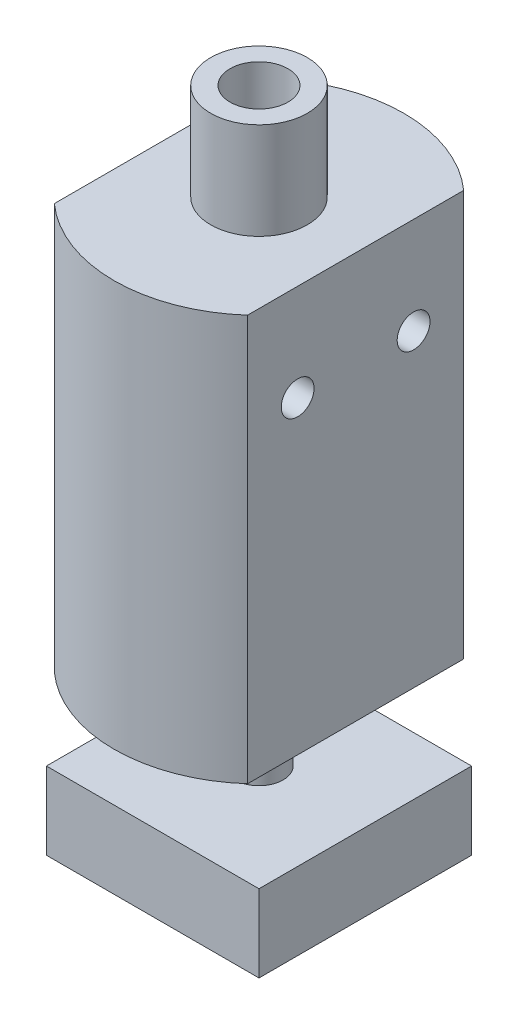
ISO-10303-21;
HEADER;
FILE_DESCRIPTION(('STEP AP214'),'2;1');
FILE_NAME('part.step','',(''),(''),'','','');
FILE_SCHEMA(('AUTOMOTIVE_DESIGN { 1 0 10303 214 1 1 1 1 }'));
ENDSEC;
DATA;
#1=APPLICATION_CONTEXT('core data for automotive mechanical design processes');
#2=APPLICATION_PROTOCOL_DEFINITION('international standard','automotive_design',2000,#1);
#3=PRODUCT_CONTEXT('',#1,'mechanical');
#4=PRODUCT('Part','Part','',(#3));
#5=PRODUCT_RELATED_PRODUCT_CATEGORY('part','',(#4));
#6=PRODUCT_DEFINITION_FORMATION('','',#4);
#7=PRODUCT_DEFINITION_CONTEXT('part definition',#1,'design');
#8=PRODUCT_DEFINITION('design','',#6,#7);
#9=PRODUCT_DEFINITION_SHAPE('','',#8);
#10=(LENGTH_UNIT() NAMED_UNIT(*) SI_UNIT(.MILLI.,.METRE.));
#11=(NAMED_UNIT(*) PLANE_ANGLE_UNIT() SI_UNIT($,.RADIAN.));
#12=(NAMED_UNIT(*) SI_UNIT($,.STERADIAN.) SOLID_ANGLE_UNIT());
#13=UNCERTAINTY_MEASURE_WITH_UNIT(LENGTH_MEASURE(1.E-05),#10,'distance_accuracy_value','');
#14=(GEOMETRIC_REPRESENTATION_CONTEXT(3) GLOBAL_UNCERTAINTY_ASSIGNED_CONTEXT((#13)) GLOBAL_UNIT_ASSIGNED_CONTEXT((#10,
#11,#12)) REPRESENTATION_CONTEXT('',''));
#15=CARTESIAN_POINT('',(0.,0.,0.));
#16=DIRECTION('',(0.,0.,1.));
#17=DIRECTION('',(1.,0.,0.));
#18=AXIS2_PLACEMENT_3D('',#15,#16,#17);
#19=CARTESIAN_POINT('',(2.5,0.,0.));
#20=DIRECTION('',(0.,-1.,0.));
#21=DIRECTION('',(0.,0.,-1.));
#22=AXIS2_PLACEMENT_3D('',#19,#20,#21);
#23=PLANE('',#22);
#24=DIRECTION('',(0.,0.,1.));
#25=VECTOR('',#24,1.);
#26=CARTESIAN_POINT('',(-10.,0.,0.));
#27=LINE('',#26,#25);
#28=CARTESIAN_POINT('',(-10.,0.,-11.1803398874989));
#29=VERTEX_POINT('',#28);
#30=CARTESIAN_POINT('',(-10.,0.,11.1803398874989));
#31=VERTEX_POINT('',#30);
#32=EDGE_CURVE('E208',#29,#31,#27,.T.);
#33=ORIENTED_EDGE('',*,*,#32,.F.);
#34=CARTESIAN_POINT('',(0.,0.,0.));
#35=DIRECTION('',(0.,-1.,0.));
#36=DIRECTION('',(0.,0.,-1.));
#37=AXIS2_PLACEMENT_3D('',#34,#35,#36);
#38=CIRCLE('',#37,15.);
#39=CARTESIAN_POINT('',(10.,0.,-11.180339887499));
#40=VERTEX_POINT('',#39);
#41=EDGE_CURVE('E226',#29,#40,#38,.T.);
#42=ORIENTED_EDGE('',*,*,#41,.T.);
#43=DIRECTION('',(0.,0.,1.));
#44=VECTOR('',#43,1.);
#45=CARTESIAN_POINT('',(10.,0.,0.));
#46=LINE('',#45,#44);
#47=CARTESIAN_POINT('',(10.,0.,11.180339887499));
#48=VERTEX_POINT('',#47);
#49=EDGE_CURVE('E202',#40,#48,#46,.T.);
#50=ORIENTED_EDGE('',*,*,#49,.T.);
#51=EDGE_CURVE('E229',#48,#31,#38,.T.);
#52=ORIENTED_EDGE('',*,*,#51,.T.);
#53=EDGE_LOOP('',(#33,#42,#50,#52));
#54=FACE_BOUND('',#53,.T.);
#55=CARTESIAN_POINT('',(0.,0.,0.));
#56=DIRECTION('',(0.,-1.,0.));
#57=DIRECTION('',(0.,0.,-1.));
#58=AXIS2_PLACEMENT_3D('',#55,#56,#57);
#59=CIRCLE('',#58,2.5);
#60=CARTESIAN_POINT('',(0.,0.,-2.5));
#61=VERTEX_POINT('',#60);
#62=EDGE_CURVE('E230',#61,#61,#59,.T.);
#63=ORIENTED_EDGE('',*,*,#62,.F.);
#64=EDGE_LOOP('',(#63));
#65=FACE_BOUND('',#64,.T.);
#66=ADVANCED_FACE('F84',(#54,#65),#23,.T.);
#67=CARTESIAN_POINT('',(0.,0.,0.));
#68=DIRECTION('',(0.,-1.,0.));
#69=DIRECTION('',(0.,0.,-1.));
#70=AXIS2_PLACEMENT_3D('',#67,#68,#69);
#71=CYLINDRICAL_SURFACE('',#70,15.);
#72=DIRECTION('',(0.,-1.,0.));
#73=VECTOR('',#72,1.);
#74=CARTESIAN_POINT('',(-10.,0.,11.1803398874989));
#75=LINE('',#74,#73);
#76=CARTESIAN_POINT('',(-10.,42.,11.1803398874989));
#77=VERTEX_POINT('',#76);
#78=EDGE_CURVE('E101',#31,#77,#75,.F.);
#79=ORIENTED_EDGE('',*,*,#78,.F.);
#80=ORIENTED_EDGE('',*,*,#51,.F.);
#81=DIRECTION('',(0.,-1.,0.));
#82=VECTOR('',#81,1.);
#83=CARTESIAN_POINT('',(10.,0.,11.180339887499));
#84=LINE('',#83,#82);
#85=CARTESIAN_POINT('',(10.,42.,11.180339887499));
#86=VERTEX_POINT('',#85);
#87=EDGE_CURVE('E199',#48,#86,#84,.F.);
#88=ORIENTED_EDGE('',*,*,#87,.T.);
#89=CARTESIAN_POINT('',(0.,42.,0.));
#90=DIRECTION('',(0.,-1.,0.));
#91=DIRECTION('',(0.,0.,-1.));
#92=AXIS2_PLACEMENT_3D('',#89,#90,#91);
#93=CIRCLE('',#92,15.);
#94=EDGE_CURVE('E225',#86,#77,#93,.T.);
#95=ORIENTED_EDGE('',*,*,#94,.T.);
#96=EDGE_LOOP('',(#79,#80,#88,#95));
#97=FACE_BOUND('',#96,.T.);
#98=ADVANCED_FACE('F257',(#97),#71,.T.);
#99=DIRECTION('',(0.,-1.,0.));
#100=VECTOR('',#99,1.);
#101=CARTESIAN_POINT('',(-10.,0.,-11.1803398874989));
#102=LINE('',#101,#100);
#103=CARTESIAN_POINT('',(-10.,42.,-11.1803398874989));
#104=VERTEX_POINT('',#103);
#105=EDGE_CURVE('E205',#104,#29,#102,.T.);
#106=ORIENTED_EDGE('',*,*,#105,.F.);
#107=CARTESIAN_POINT('',(10.,42.,-11.180339887499));
#108=VERTEX_POINT('',#107);
#109=EDGE_CURVE('E222',#104,#108,#93,.T.);
#110=ORIENTED_EDGE('',*,*,#109,.T.);
#111=DIRECTION('',(0.,-1.,0.));
#112=VECTOR('',#111,1.);
#113=CARTESIAN_POINT('',(10.,0.,-11.180339887499));
#114=LINE('',#113,#112);
#115=EDGE_CURVE('E109',#108,#40,#114,.T.);
#116=ORIENTED_EDGE('',*,*,#115,.T.);
#117=ORIENTED_EDGE('',*,*,#41,.F.);
#118=EDGE_LOOP('',(#106,#110,#116,#117));
#119=FACE_BOUND('',#118,.T.);
#120=ADVANCED_FACE('F263',(#119),#71,.T.);
#121=CARTESIAN_POINT('',(15.,42.,0.));
#122=DIRECTION('',(0.,1.,0.));
#123=DIRECTION('',(0.,0.,1.));
#124=AXIS2_PLACEMENT_3D('',#121,#122,#123);
#125=PLANE('',#124);
#126=DIRECTION('',(0.,0.,-1.));
#127=VECTOR('',#126,1.);
#128=CARTESIAN_POINT('',(-10.,42.,0.));
#129=LINE('',#128,#127);
#130=EDGE_CURVE('E241',#77,#104,#129,.T.);
#131=ORIENTED_EDGE('',*,*,#130,.F.);
#132=ORIENTED_EDGE('',*,*,#94,.F.);
#133=DIRECTION('',(0.,0.,-1.));
#134=VECTOR('',#133,1.);
#135=CARTESIAN_POINT('',(10.,42.,0.));
#136=LINE('',#135,#134);
#137=EDGE_CURVE('E239',#86,#108,#136,.T.);
#138=ORIENTED_EDGE('',*,*,#137,.T.);
#139=ORIENTED_EDGE('',*,*,#109,.F.);
#140=EDGE_LOOP('',(#131,#132,#138,#139));
#141=FACE_BOUND('',#140,.T.);
#142=CARTESIAN_POINT('',(0.,42.,0.));
#143=DIRECTION('',(0.,-1.,0.));
#144=DIRECTION('',(0.,0.,-1.));
#145=AXIS2_PLACEMENT_3D('',#142,#143,#144);
#146=CIRCLE('',#145,5.);
#147=CARTESIAN_POINT('',(0.,42.,-5.));
#148=VERTEX_POINT('',#147);
#149=EDGE_CURVE('E219',#148,#148,#146,.T.);
#150=ORIENTED_EDGE('',*,*,#149,.T.);
#151=EDGE_LOOP('',(#150));
#152=FACE_BOUND('',#151,.T.);
#153=ADVANCED_FACE('F251',(#141,#152),#125,.T.);
#154=CARTESIAN_POINT('',(0.,0.,0.));
#155=DIRECTION('',(0.,-1.,0.));
#156=DIRECTION('',(0.,0.,-1.));
#157=AXIS2_PLACEMENT_3D('',#154,#155,#156);
#158=CYLINDRICAL_SURFACE('',#157,2.5);
#159=CARTESIAN_POINT('',(0.,-9.,0.));
#160=DIRECTION('',(0.,1.,0.));
#161=DIRECTION('',(0.,0.,1.));
#162=AXIS2_PLACEMENT_3D('',#159,#160,#161);
#163=CIRCLE('',#162,2.5);
#164=CARTESIAN_POINT('',(0.,-9.,2.5));
#165=VERTEX_POINT('',#164);
#166=EDGE_CURVE('E93',#165,#165,#163,.F.);
#167=ORIENTED_EDGE('',*,*,#166,.F.);
#168=EDGE_LOOP('',(#167));
#169=FACE_BOUND('',#168,.T.);
#170=ORIENTED_EDGE('',*,*,#62,.T.);
#171=EDGE_LOOP('',(#170));
#172=FACE_BOUND('',#171,.T.);
#173=ADVANCED_FACE('F247',(#169,#172),#158,.T.);
#174=CARTESIAN_POINT('',(0.,0.,0.));
#175=DIRECTION('',(0.,-1.,0.));
#176=DIRECTION('',(0.,0.,-1.));
#177=AXIS2_PLACEMENT_3D('',#174,#175,#176);
#178=CYLINDRICAL_SURFACE('',#177,5.);
#179=CARTESIAN_POINT('',(0.,52.,0.));
#180=DIRECTION('',(0.,-1.,0.));
#181=DIRECTION('',(0.,0.,-1.));
#182=AXIS2_PLACEMENT_3D('',#179,#180,#181);
#183=CIRCLE('',#182,5.);
#184=CARTESIAN_POINT('',(0.,52.,-5.));
#185=VERTEX_POINT('',#184);
#186=EDGE_CURVE('E216',#185,#185,#183,.T.);
#187=ORIENTED_EDGE('',*,*,#186,.T.);
#188=EDGE_LOOP('',(#187));
#189=FACE_BOUND('',#188,.T.);
#190=ORIENTED_EDGE('',*,*,#149,.F.);
#191=EDGE_LOOP('',(#190));
#192=FACE_BOUND('',#191,.T.);
#193=ADVANCED_FACE('F250',(#189,#192),#178,.T.);
#194=CARTESIAN_POINT('',(5.,52.,0.));
#195=DIRECTION('',(0.,1.,0.));
#196=DIRECTION('',(0.,0.,1.));
#197=AXIS2_PLACEMENT_3D('',#194,#195,#196);
#198=PLANE('',#197);
#199=CARTESIAN_POINT('',(0.,52.,0.));
#200=DIRECTION('',(0.,-1.,0.));
#201=DIRECTION('',(0.,0.,-1.));
#202=AXIS2_PLACEMENT_3D('',#199,#200,#201);
#203=CIRCLE('',#202,3.);
#204=CARTESIAN_POINT('',(0.,52.,-3.));
#205=VERTEX_POINT('',#204);
#206=EDGE_CURVE('E213',#205,#205,#203,.T.);
#207=ORIENTED_EDGE('',*,*,#206,.T.);
#208=EDGE_LOOP('',(#207));
#209=FACE_BOUND('',#208,.T.);
#210=ORIENTED_EDGE('',*,*,#186,.F.);
#211=EDGE_LOOP('',(#210));
#212=FACE_BOUND('',#211,.T.);
#213=ADVANCED_FACE('F322',(#209,#212),#198,.T.);
#214=CARTESIAN_POINT('',(0.,0.,0.));
#215=DIRECTION('',(0.,-1.,0.));
#216=DIRECTION('',(0.,0.,-1.));
#217=AXIS2_PLACEMENT_3D('',#214,#215,#216);
#218=CYLINDRICAL_SURFACE('',#217,3.);
#219=CARTESIAN_POINT('',(0.,42.,0.));
#220=DIRECTION('',(0.,-1.,0.));
#221=DIRECTION('',(0.,0.,-1.));
#222=AXIS2_PLACEMENT_3D('',#219,#220,#221);
#223=CIRCLE('',#222,3.);
#224=CARTESIAN_POINT('',(0.,42.,-3.));
#225=VERTEX_POINT('',#224);
#226=EDGE_CURVE('E210',#225,#225,#223,.T.);
#227=ORIENTED_EDGE('',*,*,#226,.T.);
#228=EDGE_LOOP('',(#227));
#229=FACE_BOUND('',#228,.T.);
#230=ORIENTED_EDGE('',*,*,#206,.F.);
#231=EDGE_LOOP('',(#230));
#232=FACE_BOUND('',#231,.T.);
#233=ADVANCED_FACE('F318',(#229,#232),#218,.F.);
#234=CARTESIAN_POINT('',(3.,42.,0.));
#235=DIRECTION('',(0.,1.,0.));
#236=DIRECTION('',(0.,0.,1.));
#237=AXIS2_PLACEMENT_3D('',#234,#235,#236);
#238=PLANE('',#237);
#239=ORIENTED_EDGE('',*,*,#226,.F.);
#240=EDGE_LOOP('',(#239));
#241=FACE_BOUND('',#240,.T.);
#242=ADVANCED_FACE('F311',(#241),#238,.T.);
#243=CARTESIAN_POINT('',(10.,-23.,-15.));
#244=DIRECTION('',(1.,0.,0.));
#245=DIRECTION('',(0.,0.,-1.));
#246=AXIS2_PLACEMENT_3D('',#243,#244,#245);
#247=PLANE('',#246);
#248=CARTESIAN_POINT('',(10.,32.,-6.));
#249=DIRECTION('',(1.,0.,0.));
#250=DIRECTION('',(0.,0.,1.));
#251=AXIS2_PLACEMENT_3D('',#248,#249,#250);
#252=CIRCLE('',#251,1.7);
#253=CARTESIAN_POINT('',(10.,32.,-4.3));
#254=VERTEX_POINT('',#253);
#255=EDGE_CURVE('E467',#254,#254,#252,.T.);
#256=ORIENTED_EDGE('',*,*,#255,.F.);
#257=EDGE_LOOP('',(#256));
#258=FACE_BOUND('',#257,.T.);
#259=CARTESIAN_POINT('',(10.,32.,6.));
#260=DIRECTION('',(1.,0.,0.));
#261=DIRECTION('',(0.,0.,-1.));
#262=AXIS2_PLACEMENT_3D('',#259,#260,#261);
#263=CIRCLE('',#262,1.7);
#264=CARTESIAN_POINT('',(10.,32.,4.3));
#265=VERTEX_POINT('',#264);
#266=EDGE_CURVE('E179',#265,#265,#263,.T.);
#267=ORIENTED_EDGE('',*,*,#266,.F.);
#268=EDGE_LOOP('',(#267));
#269=FACE_BOUND('',#268,.T.);
#270=ORIENTED_EDGE('',*,*,#115,.F.);
#271=ORIENTED_EDGE('',*,*,#137,.F.);
#272=ORIENTED_EDGE('',*,*,#87,.F.);
#273=ORIENTED_EDGE('',*,*,#49,.F.);
#274=EDGE_LOOP('',(#270,#271,#272,#273));
#275=FACE_BOUND('',#274,.T.);
#276=ADVANCED_FACE('F308',(#258,#269,#275),#247,.T.);
#277=CARTESIAN_POINT('',(-10.,-23.,-15.));
#278=DIRECTION('',(1.,0.,0.));
#279=DIRECTION('',(0.,0.,-1.));
#280=AXIS2_PLACEMENT_3D('',#277,#278,#279);
#281=PLANE('',#280);
#282=CARTESIAN_POINT('',(-10.,32.,-6.));
#283=DIRECTION('',(1.,0.,0.));
#284=DIRECTION('',(0.,0.,-1.));
#285=AXIS2_PLACEMENT_3D('',#282,#283,#284);
#286=CIRCLE('',#285,1.7);
#287=CARTESIAN_POINT('',(-10.,32.,-7.7));
#288=VERTEX_POINT('',#287);
#289=EDGE_CURVE('E88',#288,#288,#286,.T.);
#290=ORIENTED_EDGE('',*,*,#289,.T.);
#291=EDGE_LOOP('',(#290));
#292=FACE_BOUND('',#291,.T.);
#293=CARTESIAN_POINT('',(-10.,32.,6.));
#294=DIRECTION('',(1.,0.,0.));
#295=DIRECTION('',(0.,0.,-1.));
#296=AXIS2_PLACEMENT_3D('',#293,#294,#295);
#297=CIRCLE('',#296,1.7);
#298=CARTESIAN_POINT('',(-10.,32.,4.3));
#299=VERTEX_POINT('',#298);
#300=EDGE_CURVE('E176',#299,#299,#297,.T.);
#301=ORIENTED_EDGE('',*,*,#300,.T.);
#302=EDGE_LOOP('',(#301));
#303=FACE_BOUND('',#302,.T.);
#304=ORIENTED_EDGE('',*,*,#32,.T.);
#305=ORIENTED_EDGE('',*,*,#78,.T.);
#306=ORIENTED_EDGE('',*,*,#130,.T.);
#307=ORIENTED_EDGE('',*,*,#105,.T.);
#308=EDGE_LOOP('',(#304,#305,#306,#307));
#309=FACE_BOUND('',#308,.T.);
#310=ADVANCED_FACE('F307',(#292,#303,#309),#281,.F.);
#311=CARTESIAN_POINT('',(11.,-17.,-11.));
#312=DIRECTION('',(1.,0.,0.));
#313=DIRECTION('',(0.,0.,-1.));
#314=AXIS2_PLACEMENT_3D('',#311,#312,#313);
#315=PLANE('',#314);
#316=DIRECTION('',(0.,0.,1.));
#317=VECTOR('',#316,1.);
#318=CARTESIAN_POINT('',(11.,-9.,-11.));
#319=LINE('',#318,#317);
#320=CARTESIAN_POINT('',(11.,-9.,-11.));
#321=VERTEX_POINT('',#320);
#322=CARTESIAN_POINT('',(11.,-9.,11.));
#323=VERTEX_POINT('',#322);
#324=EDGE_CURVE('E151',#321,#323,#319,.T.);
#325=ORIENTED_EDGE('',*,*,#324,.T.);
#326=DIRECTION('',(0.,1.,0.));
#327=VECTOR('',#326,1.);
#328=CARTESIAN_POINT('',(11.,-17.,11.));
#329=LINE('',#328,#327);
#330=CARTESIAN_POINT('',(11.,-17.,11.));
#331=VERTEX_POINT('',#330);
#332=EDGE_CURVE('E155',#331,#323,#329,.T.);
#333=ORIENTED_EDGE('',*,*,#332,.F.);
#334=DIRECTION('',(0.,0.,1.));
#335=VECTOR('',#334,1.);
#336=CARTESIAN_POINT('',(11.,-17.,-11.));
#337=LINE('',#336,#335);
#338=CARTESIAN_POINT('',(11.,-17.,-11.));
#339=VERTEX_POINT('',#338);
#340=EDGE_CURVE('E193',#339,#331,#337,.T.);
#341=ORIENTED_EDGE('',*,*,#340,.F.);
#342=DIRECTION('',(0.,1.,0.));
#343=VECTOR('',#342,1.);
#344=CARTESIAN_POINT('',(11.,-17.,-11.));
#345=LINE('',#344,#343);
#346=EDGE_CURVE('E157',#339,#321,#345,.T.);
#347=ORIENTED_EDGE('',*,*,#346,.T.);
#348=EDGE_LOOP('',(#325,#333,#341,#347));
#349=FACE_BOUND('',#348,.T.);
#350=ADVANCED_FACE('F153',(#349),#315,.T.);
#351=CARTESIAN_POINT('',(-11.,-17.,-11.));
#352=DIRECTION('',(0.,-1.,0.));
#353=DIRECTION('',(0.,0.,-1.));
#354=AXIS2_PLACEMENT_3D('',#351,#352,#353);
#355=PLANE('',#354);
#356=CARTESIAN_POINT('',(0.,-17.,0.));
#357=DIRECTION('',(0.,-1.,0.));
#358=DIRECTION('',(0.,0.,-1.));
#359=AXIS2_PLACEMENT_3D('',#356,#357,#358);
#360=CIRCLE('',#359,2.5);
#361=CARTESIAN_POINT('',(0.,-17.,-2.5));
#362=VERTEX_POINT('',#361);
#363=EDGE_CURVE('E13',#362,#362,#360,.F.);
#364=ORIENTED_EDGE('',*,*,#363,.T.);
#365=EDGE_LOOP('',(#364));
#366=FACE_BOUND('',#365,.T.);
#367=ORIENTED_EDGE('',*,*,#340,.T.);
#368=DIRECTION('',(1.,0.,0.));
#369=VECTOR('',#368,1.);
#370=CARTESIAN_POINT('',(-11.,-17.,11.));
#371=LINE('',#370,#369);
#372=CARTESIAN_POINT('',(-11.,-17.,11.));
#373=VERTEX_POINT('',#372);
#374=EDGE_CURVE('E175',#373,#331,#371,.T.);
#375=ORIENTED_EDGE('',*,*,#374,.F.);
#376=DIRECTION('',(0.,0.,1.));
#377=VECTOR('',#376,1.);
#378=CARTESIAN_POINT('',(-11.,-17.,-11.));
#379=LINE('',#378,#377);
#380=CARTESIAN_POINT('',(-11.,-17.,-11.));
#381=VERTEX_POINT('',#380);
#382=EDGE_CURVE('E195',#381,#373,#379,.T.);
#383=ORIENTED_EDGE('',*,*,#382,.F.);
#384=DIRECTION('',(1.,0.,0.));
#385=VECTOR('',#384,1.);
#386=CARTESIAN_POINT('',(-11.,-17.,-11.));
#387=LINE('',#386,#385);
#388=EDGE_CURVE('E162',#381,#339,#387,.T.);
#389=ORIENTED_EDGE('',*,*,#388,.T.);
#390=EDGE_LOOP('',(#367,#375,#383,#389));
#391=FACE_BOUND('',#390,.T.);
#392=ADVANCED_FACE('F295',(#366,#391),#355,.T.);
#393=CARTESIAN_POINT('',(-11.,-17.,-11.));
#394=DIRECTION('',(-1.,0.,0.));
#395=DIRECTION('',(0.,0.,1.));
#396=AXIS2_PLACEMENT_3D('',#393,#394,#395);
#397=PLANE('',#396);
#398=ORIENTED_EDGE('',*,*,#382,.T.);
#399=DIRECTION('',(0.,-1.,0.));
#400=VECTOR('',#399,1.);
#401=CARTESIAN_POINT('',(-11.,-17.,11.));
#402=LINE('',#401,#400);
#403=CARTESIAN_POINT('',(-11.,-9.,11.));
#404=VERTEX_POINT('',#403);
#405=EDGE_CURVE('E170',#404,#373,#402,.T.);
#406=ORIENTED_EDGE('',*,*,#405,.F.);
#407=DIRECTION('',(0.,0.,1.));
#408=VECTOR('',#407,1.);
#409=CARTESIAN_POINT('',(-11.,-9.,-11.));
#410=LINE('',#409,#408);
#411=CARTESIAN_POINT('',(-11.,-9.,-11.));
#412=VERTEX_POINT('',#411);
#413=EDGE_CURVE('E161',#412,#404,#410,.T.);
#414=ORIENTED_EDGE('',*,*,#413,.F.);
#415=DIRECTION('',(0.,-1.,0.));
#416=VECTOR('',#415,1.);
#417=CARTESIAN_POINT('',(-11.,-17.,-11.));
#418=LINE('',#417,#416);
#419=EDGE_CURVE('E188',#412,#381,#418,.T.);
#420=ORIENTED_EDGE('',*,*,#419,.T.);
#421=EDGE_LOOP('',(#398,#406,#414,#420));
#422=FACE_BOUND('',#421,.T.);
#423=ADVANCED_FACE('F298',(#422),#397,.T.);
#424=CARTESIAN_POINT('',(-11.,-9.,-11.));
#425=DIRECTION('',(0.,1.,0.));
#426=DIRECTION('',(0.,0.,1.));
#427=AXIS2_PLACEMENT_3D('',#424,#425,#426);
#428=PLANE('',#427);
#429=ORIENTED_EDGE('',*,*,#166,.T.);
#430=EDGE_LOOP('',(#429));
#431=FACE_BOUND('',#430,.T.);
#432=ORIENTED_EDGE('',*,*,#413,.T.);
#433=DIRECTION('',(-1.,0.,0.));
#434=VECTOR('',#433,1.);
#435=CARTESIAN_POINT('',(-11.,-9.,11.));
#436=LINE('',#435,#434);
#437=EDGE_CURVE('E165',#323,#404,#436,.T.);
#438=ORIENTED_EDGE('',*,*,#437,.F.);
#439=ORIENTED_EDGE('',*,*,#324,.F.);
#440=DIRECTION('',(-1.,0.,0.));
#441=VECTOR('',#440,1.);
#442=CARTESIAN_POINT('',(-11.,-9.,-11.));
#443=LINE('',#442,#441);
#444=EDGE_CURVE('E186',#321,#412,#443,.T.);
#445=ORIENTED_EDGE('',*,*,#444,.T.);
#446=EDGE_LOOP('',(#432,#438,#439,#445));
#447=FACE_BOUND('',#446,.T.);
#448=ADVANCED_FACE('F166',(#431,#447),#428,.T.);
#449=CARTESIAN_POINT('',(0.,0.,-11.));
#450=DIRECTION('',(0.,0.,-1.));
#451=DIRECTION('',(-1.,0.,0.));
#452=AXIS2_PLACEMENT_3D('',#449,#450,#451);
#453=PLANE('',#452);
#454=ORIENTED_EDGE('',*,*,#346,.F.);
#455=ORIENTED_EDGE('',*,*,#388,.F.);
#456=ORIENTED_EDGE('',*,*,#419,.F.);
#457=ORIENTED_EDGE('',*,*,#444,.F.);
#458=EDGE_LOOP('',(#454,#455,#456,#457));
#459=FACE_BOUND('',#458,.T.);
#460=ADVANCED_FACE('F285',(#459),#453,.T.);
#461=CARTESIAN_POINT('',(0.,0.,11.));
#462=DIRECTION('',(0.,0.,-1.));
#463=DIRECTION('',(-1.,0.,0.));
#464=AXIS2_PLACEMENT_3D('',#461,#462,#463);
#465=PLANE('',#464);
#466=ORIENTED_EDGE('',*,*,#332,.T.);
#467=ORIENTED_EDGE('',*,*,#437,.T.);
#468=ORIENTED_EDGE('',*,*,#405,.T.);
#469=ORIENTED_EDGE('',*,*,#374,.T.);
#470=EDGE_LOOP('',(#466,#467,#468,#469));
#471=FACE_BOUND('',#470,.T.);
#472=ADVANCED_FACE('F173',(#471),#465,.F.);
#473=CARTESIAN_POINT('',(0.2,-23.,0.));
#474=DIRECTION('',(0.,-1.,0.));
#475=DIRECTION('',(0.,0.,-1.));
#476=AXIS2_PLACEMENT_3D('',#473,#474,#475);
#477=PLANE('',#476);
#478=CARTESIAN_POINT('',(0.,-23.,0.));
#479=DIRECTION('',(0.,-1.,0.));
#480=DIRECTION('',(0.,0.,-1.));
#481=AXIS2_PLACEMENT_3D('',#478,#479,#480);
#482=CIRCLE('',#481,0.2);
#483=CARTESIAN_POINT('',(0.,-23.,0.200000000000001));
#484=VERTEX_POINT('',#483);
#485=EDGE_CURVE('E236',#484,#484,#482,.T.);
#486=ORIENTED_EDGE('',*,*,#485,.T.);
#487=EDGE_LOOP('',(#486));
#488=FACE_BOUND('',#487,.T.);
#489=ADVANCED_FACE('F86',(#488),#477,.T.);
#490=CARTESIAN_POINT('',(0.,-23.,0.));
#491=DIRECTION('',(0.,1.,0.));
#492=DIRECTION('',(0.,0.,1.));
#493=AXIS2_PLACEMENT_3D('',#490,#491,#492);
#494=CONICAL_SURFACE('',#493,0.2,0.523598775598303);
#495=CARTESIAN_POINT('',(0.,-19.0162831425916,0.));
#496=DIRECTION('',(0.,-1.,0.));
#497=DIRECTION('',(0.,0.,-1.));
#498=AXIS2_PLACEMENT_3D('',#495,#496,#497);
#499=CIRCLE('',#498,2.5);
#500=CARTESIAN_POINT('',(0.,-19.0162831425916,2.5));
#501=VERTEX_POINT('',#500);
#502=EDGE_CURVE('E233',#501,#501,#499,.T.);
#503=CARTESIAN_POINT('',(0.,-19.0162831425916,2.5));
#504=CARTESIAN_POINT('',(0.,-19.0577801931896,2.47604166666667));
#505=CARTESIAN_POINT('',(0.,-19.0992772437876,2.45208333333334));
#506=CARTESIAN_POINT('',(0.,-19.1822713449836,2.40416666666667));
#507=CARTESIAN_POINT('',(0.,-19.2237683955816,2.38020833333334));
#508=CARTESIAN_POINT('',(0.,-19.3067624967776,2.33229166666667));
#509=CARTESIAN_POINT('',(0.,-19.3482595473757,2.30833333333334));
#510=CARTESIAN_POINT('',(0.,-19.4312536485717,2.26041666666667));
#511=CARTESIAN_POINT('',(0.,-19.4727506991697,2.23645833333334));
#512=CARTESIAN_POINT('',(0.,-19.5557448003657,2.18854166666667));
#513=CARTESIAN_POINT('',(0.,-19.5972418509637,2.16458333333334));
#514=CARTESIAN_POINT('',(0.,-19.6802359521597,2.11666666666667));
#515=CARTESIAN_POINT('',(0.,-19.7217330027577,2.09270833333334));
#516=CARTESIAN_POINT('',(0.,-19.8047271039537,2.04479166666667));
#517=CARTESIAN_POINT('',(0.,-19.8462241545517,2.02083333333334));
#518=CARTESIAN_POINT('',(0.,-19.9292182557477,1.97291666666667));
#519=CARTESIAN_POINT('',(0.,-19.9707153063457,1.94895833333334));
#520=CARTESIAN_POINT('',(0.,-20.0537094075417,1.90104166666667));
#521=CARTESIAN_POINT('',(0.,-20.0952064581397,1.87708333333334));
#522=CARTESIAN_POINT('',(0.,-20.1782005593357,1.82916666666667));
#523=CARTESIAN_POINT('',(0.,-20.2196976099337,1.80520833333334));
#524=CARTESIAN_POINT('',(0.,-20.3026917111297,1.75729166666667));
#525=CARTESIAN_POINT('',(0.,-20.3441887617277,1.73333333333334));
#526=CARTESIAN_POINT('',(0.,-20.4271828629238,1.68541666666667));
#527=CARTESIAN_POINT('',(0.,-20.4686799135218,1.66145833333334));
#528=CARTESIAN_POINT('',(0.,-20.5516740147178,1.61354166666667));
#529=CARTESIAN_POINT('',(0.,-20.5931710653158,1.58958333333334));
#530=CARTESIAN_POINT('',(0.,-20.6761651665118,1.54166666666667));
#531=CARTESIAN_POINT('',(0.,-20.7176622171098,1.51770833333334));
#532=CARTESIAN_POINT('',(0.,-20.8006563183058,1.46979166666667));
#533=CARTESIAN_POINT('',(0.,-20.8421533689038,1.44583333333334));
#534=CARTESIAN_POINT('',(0.,-20.9251474700998,1.39791666666667));
#535=CARTESIAN_POINT('',(0.,-20.9666445206978,1.37395833333334));
#536=CARTESIAN_POINT('',(0.,-21.0496386218938,1.32604166666667));
#537=CARTESIAN_POINT('',(0.,-21.0911356724918,1.30208333333334));
#538=CARTESIAN_POINT('',(0.,-21.1741297736878,1.25416666666667));
#539=CARTESIAN_POINT('',(0.,-21.2156268242858,1.23020833333334));
#540=CARTESIAN_POINT('',(0.,-21.2986209254818,1.18229166666667));
#541=CARTESIAN_POINT('',(0.,-21.3401179760798,1.15833333333334));
#542=CARTESIAN_POINT('',(0.,-21.4231120772758,1.11041666666667));
#543=CARTESIAN_POINT('',(0.,-21.4646091278739,1.08645833333334));
#544=CARTESIAN_POINT('',(0.,-21.5476032290699,1.03854166666667));
#545=CARTESIAN_POINT('',(0.,-21.5891002796679,1.01458333333334));
#546=CARTESIAN_POINT('',(0.,-21.6720943808639,0.966666666666668));
#547=CARTESIAN_POINT('',(0.,-21.7135914314619,0.942708333333335));
#548=CARTESIAN_POINT('',(0.,-21.7965855326579,0.894791666666668));
#549=CARTESIAN_POINT('',(0.,-21.8380825832559,0.870833333333335));
#550=CARTESIAN_POINT('',(0.,-21.9210766844519,0.822916666666668));
#551=CARTESIAN_POINT('',(0.,-21.9625737350499,0.798958333333335));
#552=CARTESIAN_POINT('',(0.,-22.0455678362459,0.751041666666668));
#553=CARTESIAN_POINT('',(0.,-22.0870648868439,0.727083333333335));
#554=CARTESIAN_POINT('',(0.,-22.1700589880399,0.679166666666668));
#555=CARTESIAN_POINT('',(0.,-22.2115560386379,0.655208333333335));
#556=CARTESIAN_POINT('',(0.,-22.2945501398339,0.607291666666668));
#557=CARTESIAN_POINT('',(0.,-22.3360471904319,0.583333333333335));
#558=CARTESIAN_POINT('',(0.,-22.4190412916279,0.535416666666668));
#559=CARTESIAN_POINT('',(0.,-22.4605383422259,0.511458333333335));
#560=CARTESIAN_POINT('',(0.,-22.543532443422,0.463541666666668));
#561=CARTESIAN_POINT('',(0.,-22.58502949402,0.439583333333335));
#562=CARTESIAN_POINT('',(0.,-22.668023595216,0.391666666666668));
#563=CARTESIAN_POINT('',(0.,-22.709520645814,0.367708333333334));
#564=CARTESIAN_POINT('',(0.,-22.79251474701,0.319791666666668));
#565=CARTESIAN_POINT('',(0.,-22.834011797608,0.295833333333334));
#566=CARTESIAN_POINT('',(0.,-22.917005898804,0.247916666666668));
#567=CARTESIAN_POINT('',(0.,-22.958502949402,0.223958333333334));
#568=CARTESIAN_POINT('',(0.,-23.,0.200000000000001));
#569=B_SPLINE_CURVE_WITH_KNOTS('',3,(#503,#504,#505,#506,#507,#508,#509,#510,#511,#512,#513,
#514,#515,#516,#517,#518,#519,#520,#521,#522,#523,#524,#525,#526,#527,#528,#529,#530,#531,#532,
#533,#534,#535,#536,#537,#538,#539,#540,#541,#542,#543,#544,#545,#546,#547,#548,#549,#550,#551,
#552,#553,#554,#555,#556,#557,#558,#559,#560,#561,#562,#563,#564,#565,#566,#567,#568),
.UNSPECIFIED.,.F.,.F.,(4,2,2,2,2,2,2,2,2,2,2,2,2,2,2,2,2,2,2,2,2,2,2,2,2,2,2,2,2,2,2,2,4),(0.,
0.143749999999996,0.287499999999996,0.431249999999995,0.574999999999994,0.718749999999994,
0.862499999999993,1.00624999999999,1.14999999999999,1.29374999999999,1.43749999999999,
1.58124999999999,1.72499999999999,1.86874999999999,2.01249999999999,2.15624999999998,
2.29999999999998,2.44374999999998,2.58749999999998,2.73124999999998,2.87499999999998,
3.01874999999998,3.16249999999998,3.30624999999998,3.44999999999997,3.59374999999997,
3.73749999999997,3.88124999999997,4.02499999999997,4.16874999999997,4.31249999999997,
4.45624999999997,4.59999999999997),.UNSPECIFIED.);
#570=EDGE_CURVE('BSEAM268',#501,#484,#569,.T.);
#571=ORIENTED_EDGE('',*,*,#502,.T.);
#572=ORIENTED_EDGE('',*,*,#485,.F.);
#573=ORIENTED_EDGE('',*,*,#570,.T.);
#574=ORIENTED_EDGE('',*,*,#570,.F.);
#575=EDGE_LOOP('',(#571,#573,#572,#574));
#576=FACE_BOUND('',#575,.T.);
#577=ADVANCED_FACE('F268',(#576),#494,.T.);
#578=ORIENTED_EDGE('',*,*,#363,.F.);
#579=EDGE_LOOP('',(#578));
#580=FACE_BOUND('',#579,.T.);
#581=ORIENTED_EDGE('',*,*,#502,.F.);
#582=EDGE_LOOP('',(#581));
#583=FACE_BOUND('',#582,.T.);
#584=ADVANCED_FACE('F253',(#580,#583),#158,.T.);
#585=CARTESIAN_POINT('',(-11.,32.,6.));
#586=DIRECTION('',(1.,0.,0.));
#587=DIRECTION('',(0.,0.,-1.));
#588=AXIS2_PLACEMENT_3D('',#585,#586,#587);
#589=CYLINDRICAL_SURFACE('',#588,1.7);
#590=ORIENTED_EDGE('',*,*,#266,.T.);
#591=EDGE_LOOP('',(#590));
#592=FACE_BOUND('',#591,.T.);
#593=ORIENTED_EDGE('',*,*,#300,.F.);
#594=EDGE_LOOP('',(#593));
#595=FACE_BOUND('',#594,.T.);
#596=ADVANCED_FACE('F275',(#592,#595),#589,.F.);
#597=CARTESIAN_POINT('',(-11.,32.,-6.));
#598=DIRECTION('',(1.,0.,0.));
#599=DIRECTION('',(0.,0.,-1.));
#600=AXIS2_PLACEMENT_3D('',#597,#598,#599);
#601=CYLINDRICAL_SURFACE('',#600,1.7);
#602=ORIENTED_EDGE('',*,*,#255,.T.);
#603=EDGE_LOOP('',(#602));
#604=FACE_BOUND('',#603,.T.);
#605=ORIENTED_EDGE('',*,*,#289,.F.);
#606=EDGE_LOOP('',(#605));
#607=FACE_BOUND('',#606,.T.);
#608=ADVANCED_FACE('F452',(#604,#607),#601,.F.);
#609=CLOSED_SHELL('',(#66,#98,#120,#153,#173,#193,#213,#233,#242,#276,#310,#350,#392,#423,#448,
#460,#472,#489,#577,#584,#596,#608));
#610=MANIFOLD_SOLID_BREP('B2',#609);
#611=ADVANCED_BREP_SHAPE_REPRESENTATION('',(#18,#610),#14);
#612=SHAPE_DEFINITION_REPRESENTATION(#9,#611);
ENDSEC;
END-ISO-10303-21;
